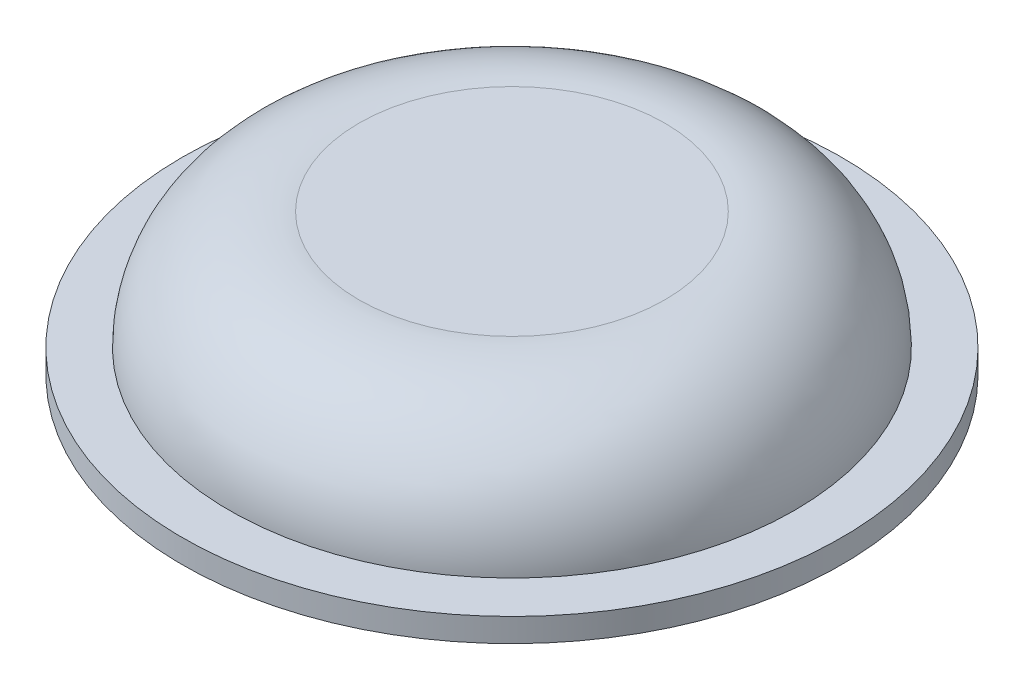
ISO-10303-21;
HEADER;
FILE_DESCRIPTION(('STEP AP214'),'2;1');
FILE_NAME('part.step','',(''),(''),'','','');
FILE_SCHEMA(('AUTOMOTIVE_DESIGN { 1 0 10303 214 1 1 1 1 }'));
ENDSEC;
DATA;
#1=APPLICATION_CONTEXT('core data for automotive mechanical design processes');
#2=APPLICATION_PROTOCOL_DEFINITION('international standard','automotive_design',2000,#1);
#3=PRODUCT_CONTEXT('',#1,'mechanical');
#4=PRODUCT('Part','Part','',(#3));
#5=PRODUCT_RELATED_PRODUCT_CATEGORY('part','',(#4));
#6=PRODUCT_DEFINITION_FORMATION('','',#4);
#7=PRODUCT_DEFINITION_CONTEXT('part definition',#1,'design');
#8=PRODUCT_DEFINITION('design','',#6,#7);
#9=PRODUCT_DEFINITION_SHAPE('','',#8);
#10=(LENGTH_UNIT() NAMED_UNIT(*) SI_UNIT(.MILLI.,.METRE.));
#11=(NAMED_UNIT(*) PLANE_ANGLE_UNIT() SI_UNIT($,.RADIAN.));
#12=(NAMED_UNIT(*) SI_UNIT($,.STERADIAN.) SOLID_ANGLE_UNIT());
#13=UNCERTAINTY_MEASURE_WITH_UNIT(LENGTH_MEASURE(1.E-05),#10,'distance_accuracy_value','');
#14=(GEOMETRIC_REPRESENTATION_CONTEXT(3) GLOBAL_UNCERTAINTY_ASSIGNED_CONTEXT((#13)) GLOBAL_UNIT_ASSIGNED_CONTEXT((#10,
#11,#12)) REPRESENTATION_CONTEXT('',''));
#15=CARTESIAN_POINT('',(0.,0.,0.));
#16=DIRECTION('',(0.,0.,1.));
#17=DIRECTION('',(1.,0.,0.));
#18=AXIS2_PLACEMENT_3D('',#15,#16,#17);
#19=CARTESIAN_POINT('',(-26.67,0.,0.));
#20=DIRECTION('',(0.,-1.,0.));
#21=DIRECTION('',(1.,0.,0.));
#22=AXIS2_PLACEMENT_3D('',#19,#20,#21);
#23=PLANE('',#22);
#24=CARTESIAN_POINT('',(0.,0.,0.));
#25=DIRECTION('',(0.,1.,0.));
#26=DIRECTION('',(-1.,0.,0.));
#27=AXIS2_PLACEMENT_3D('',#24,#25,#26);
#28=CIRCLE('',#27,26.67);
#29=CARTESIAN_POINT('',(-26.67,0.,0.));
#30=VERTEX_POINT('',#29);
#31=EDGE_CURVE('E68',#30,#30,#28,.T.);
#32=ORIENTED_EDGE('',*,*,#31,.T.);
#33=EDGE_LOOP('',(#32));
#34=FACE_BOUND('',#33,.T.);
#35=CARTESIAN_POINT('',(0.,0.,0.));
#36=DIRECTION('',(0.,1.,0.));
#37=DIRECTION('',(-1.,0.,0.));
#38=AXIS2_PLACEMENT_3D('',#35,#36,#37);
#39=CIRCLE('',#38,35.56);
#40=CARTESIAN_POINT('',(-35.56,0.,0.));
#41=VERTEX_POINT('',#40);
#42=EDGE_CURVE('E10',#41,#41,#39,.T.);
#43=ORIENTED_EDGE('',*,*,#42,.F.);
#44=EDGE_LOOP('',(#43));
#45=FACE_BOUND('',#44,.T.);
#46=ADVANCED_FACE('F37',(#34,#45),#23,.T.);
#47=CARTESIAN_POINT('',(0.,15.24,0.));
#48=DIRECTION('',(0.,1.,0.));
#49=DIRECTION('',(-1.,0.,0.));
#50=AXIS2_PLACEMENT_3D('',#47,#48,#49);
#51=CYLINDRICAL_SURFACE('',#50,35.56);
#52=ORIENTED_EDGE('',*,*,#42,.T.);
#53=EDGE_LOOP('',(#52));
#54=FACE_BOUND('',#53,.T.);
#55=CARTESIAN_POINT('',(0.,2.54,0.));
#56=DIRECTION('',(0.,1.,0.));
#57=DIRECTION('',(-1.,0.,0.));
#58=AXIS2_PLACEMENT_3D('',#55,#56,#57);
#59=CIRCLE('',#58,35.56);
#60=CARTESIAN_POINT('',(-35.56,2.54,0.));
#61=VERTEX_POINT('',#60);
#62=EDGE_CURVE('E43',#61,#61,#59,.T.);
#63=ORIENTED_EDGE('',*,*,#62,.F.);
#64=EDGE_LOOP('',(#63));
#65=FACE_BOUND('',#64,.T.);
#66=ADVANCED_FACE('F86',(#54,#65),#51,.T.);
#67=CARTESIAN_POINT('',(-35.56,2.54,0.));
#68=DIRECTION('',(0.,1.,0.));
#69=DIRECTION('',(-1.,0.,0.));
#70=AXIS2_PLACEMENT_3D('',#67,#68,#69);
#71=PLANE('',#70);
#72=ORIENTED_EDGE('',*,*,#62,.T.);
#73=EDGE_LOOP('',(#72));
#74=FACE_BOUND('',#73,.T.);
#75=CARTESIAN_POINT('',(0.,2.54,0.));
#76=DIRECTION('',(0.,1.,0.));
#77=DIRECTION('',(-1.,0.,0.));
#78=AXIS2_PLACEMENT_3D('',#75,#76,#77);
#79=CIRCLE('',#78,30.48);
#80=CARTESIAN_POINT('',(-30.48,2.54,0.));
#81=VERTEX_POINT('',#80);
#82=EDGE_CURVE('E47',#81,#81,#79,.T.);
#83=ORIENTED_EDGE('',*,*,#82,.F.);
#84=EDGE_LOOP('',(#83));
#85=FACE_BOUND('',#84,.T.);
#86=ADVANCED_FACE('F90',(#74,#85),#71,.T.);
#87=CARTESIAN_POINT('',(0.,2.54,0.));
#88=DIRECTION('',(0.,1.,0.));
#89=DIRECTION('',(-1.,0.,0.));
#90=AXIS2_PLACEMENT_3D('',#87,#88,#89);
#91=TOROIDAL_SURFACE('',#90,17.7222727272727,12.7577272727273);
#92=ORIENTED_EDGE('',*,*,#82,.T.);
#93=EDGE_LOOP('',(#92));
#94=FACE_BOUND('',#93,.T.);
#95=CARTESIAN_POINT('',(0.,15.24,0.));
#96=DIRECTION('',(0.,1.,0.));
#97=DIRECTION('',(-1.,0.,0.));
#98=AXIS2_PLACEMENT_3D('',#95,#96,#97);
#99=CIRCLE('',#98,16.51);
#100=CARTESIAN_POINT('',(-16.51,15.24,0.));
#101=VERTEX_POINT('',#100);
#102=EDGE_CURVE('E51',#101,#101,#99,.T.);
#103=ORIENTED_EDGE('',*,*,#102,.F.);
#104=EDGE_LOOP('',(#103));
#105=FACE_BOUND('',#104,.T.);
#106=ADVANCED_FACE('F94',(#94,#105),#91,.T.);
#107=CARTESIAN_POINT('',(-16.51,15.24,0.));
#108=DIRECTION('',(0.,1.,0.));
#109=DIRECTION('',(-1.,0.,0.));
#110=AXIS2_PLACEMENT_3D('',#107,#108,#109);
#111=PLANE('',#110);
#112=ORIENTED_EDGE('',*,*,#102,.T.);
#113=EDGE_LOOP('',(#112));
#114=FACE_BOUND('',#113,.T.);
#115=ADVANCED_FACE('F100',(#114),#111,.T.);
#116=CARTESIAN_POINT('',(0.,6.42755065604916,0.));
#117=DIRECTION('',(0.,-1.,0.));
#118=DIRECTION('',(1.,0.,0.));
#119=AXIS2_PLACEMENT_3D('',#116,#117,#118);
#120=PLANE('',#119);
#121=CARTESIAN_POINT('',(0.,6.42755065604916,0.));
#122=DIRECTION('',(0.,1.,0.));
#123=DIRECTION('',(-1.,0.,0.));
#124=AXIS2_PLACEMENT_3D('',#121,#122,#123);
#125=CIRCLE('',#124,2.54);
#126=CARTESIAN_POINT('',(-2.54,6.42755065604916,0.));
#127=VERTEX_POINT('',#126);
#128=EDGE_CURVE('E56',#127,#127,#125,.T.);
#129=ORIENTED_EDGE('',*,*,#128,.F.);
#130=EDGE_LOOP('',(#129));
#131=FACE_BOUND('',#130,.T.);
#132=ADVANCED_FACE('F104',(#131),#120,.T.);
#133=CARTESIAN_POINT('',(0.,15.24,0.));
#134=DIRECTION('',(0.,1.,0.));
#135=DIRECTION('',(-1.,0.,0.));
#136=AXIS2_PLACEMENT_3D('',#133,#134,#135);
#137=CYLINDRICAL_SURFACE('',#136,2.54);
#138=ORIENTED_EDGE('',*,*,#128,.T.);
#139=EDGE_LOOP('',(#138));
#140=FACE_BOUND('',#139,.T.);
#141=CARTESIAN_POINT('',(0.,11.43,0.));
#142=DIRECTION('',(0.,1.,0.));
#143=DIRECTION('',(-1.,0.,0.));
#144=AXIS2_PLACEMENT_3D('',#141,#142,#143);
#145=CIRCLE('',#144,2.54);
#146=CARTESIAN_POINT('',(-2.54,11.43,0.));
#147=VERTEX_POINT('',#146);
#148=EDGE_CURVE('E59',#147,#147,#145,.T.);
#149=ORIENTED_EDGE('',*,*,#148,.F.);
#150=EDGE_LOOP('',(#149));
#151=FACE_BOUND('',#150,.T.);
#152=ADVANCED_FACE('F108',(#140,#151),#137,.T.);
#153=CARTESIAN_POINT('',(-2.54,11.43,0.));
#154=DIRECTION('',(0.,-1.,0.));
#155=DIRECTION('',(1.,0.,0.));
#156=AXIS2_PLACEMENT_3D('',#153,#154,#155);
#157=PLANE('',#156);
#158=ORIENTED_EDGE('',*,*,#148,.T.);
#159=EDGE_LOOP('',(#158));
#160=FACE_BOUND('',#159,.T.);
#161=CARTESIAN_POINT('',(0.,11.43,0.));
#162=DIRECTION('',(0.,1.,0.));
#163=DIRECTION('',(-1.,0.,0.));
#164=AXIS2_PLACEMENT_3D('',#161,#162,#163);
#165=CIRCLE('',#164,22.7591220023488);
#166=CARTESIAN_POINT('',(-22.7591220023488,11.43,0.));
#167=VERTEX_POINT('',#166);
#168=EDGE_CURVE('E62',#167,#167,#165,.T.);
#169=ORIENTED_EDGE('',*,*,#168,.F.);
#170=EDGE_LOOP('',(#169));
#171=FACE_BOUND('',#170,.T.);
#172=ADVANCED_FACE('F82',(#160,#171),#157,.T.);
#173=CARTESIAN_POINT('',(0.,2.54,0.));
#174=DIRECTION('',(0.,1.,0.));
#175=DIRECTION('',(-1.,0.,0.));
#176=AXIS2_PLACEMENT_3D('',#173,#174,#175);
#177=TOROIDAL_SURFACE('',#176,17.7222727272727,10.2177272727273);
#178=ORIENTED_EDGE('',*,*,#168,.T.);
#179=EDGE_LOOP('',(#178));
#180=FACE_BOUND('',#179,.T.);
#181=CARTESIAN_POINT('',(0.,7.47357145207477,0.));
#182=DIRECTION('',(0.,1.,0.));
#183=DIRECTION('',(-1.,0.,0.));
#184=AXIS2_PLACEMENT_3D('',#181,#182,#183);
#185=CIRCLE('',#184,26.67);
#186=CARTESIAN_POINT('',(-26.67,7.47357145207477,0.));
#187=VERTEX_POINT('',#186);
#188=EDGE_CURVE('E65',#187,#187,#185,.T.);
#189=ORIENTED_EDGE('',*,*,#188,.F.);
#190=EDGE_LOOP('',(#189));
#191=FACE_BOUND('',#190,.T.);
#192=ADVANCED_FACE('F76',(#180,#191),#177,.F.);
#193=CARTESIAN_POINT('',(0.,15.24,0.));
#194=DIRECTION('',(0.,1.,0.));
#195=DIRECTION('',(-1.,0.,0.));
#196=AXIS2_PLACEMENT_3D('',#193,#194,#195);
#197=CYLINDRICAL_SURFACE('',#196,26.67);
#198=ORIENTED_EDGE('',*,*,#188,.T.);
#199=EDGE_LOOP('',(#198));
#200=FACE_BOUND('',#199,.T.);
#201=ORIENTED_EDGE('',*,*,#31,.F.);
#202=EDGE_LOOP('',(#201));
#203=FACE_BOUND('',#202,.T.);
#204=ADVANCED_FACE('F74',(#200,#203),#197,.F.);
#205=CLOSED_SHELL('',(#46,#66,#86,#106,#115,#132,#152,#172,#192,#204));
#206=MANIFOLD_SOLID_BREP('B2',#205);
#207=ADVANCED_BREP_SHAPE_REPRESENTATION('',(#18,#206),#14);
#208=SHAPE_DEFINITION_REPRESENTATION(#9,#207);
ENDSEC;
END-ISO-10303-21;
